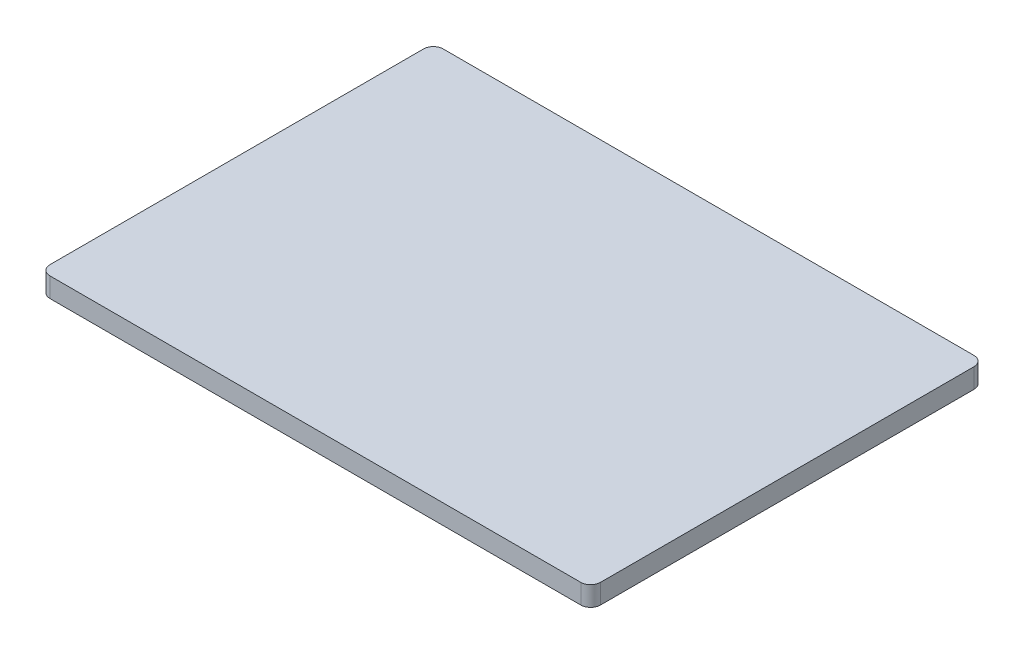
ISO-10303-21;
HEADER;
FILE_DESCRIPTION(('STEP AP214'),'2;1');
FILE_NAME('part.step','',(''),(''),'','','');
FILE_SCHEMA(('AUTOMOTIVE_DESIGN { 1 0 10303 214 1 1 1 1 }'));
ENDSEC;
DATA;
#1=APPLICATION_CONTEXT('core data for automotive mechanical design processes');
#2=APPLICATION_PROTOCOL_DEFINITION('international standard','automotive_design',2000,#1);
#3=PRODUCT_CONTEXT('',#1,'mechanical');
#4=PRODUCT('Part','Part','',(#3));
#5=PRODUCT_RELATED_PRODUCT_CATEGORY('part','',(#4));
#6=PRODUCT_DEFINITION_FORMATION('','',#4);
#7=PRODUCT_DEFINITION_CONTEXT('part definition',#1,'design');
#8=PRODUCT_DEFINITION('design','',#6,#7);
#9=PRODUCT_DEFINITION_SHAPE('','',#8);
#10=(LENGTH_UNIT() NAMED_UNIT(*) SI_UNIT(.MILLI.,.METRE.));
#11=(NAMED_UNIT(*) PLANE_ANGLE_UNIT() SI_UNIT($,.RADIAN.));
#12=(NAMED_UNIT(*) SI_UNIT($,.STERADIAN.) SOLID_ANGLE_UNIT());
#13=UNCERTAINTY_MEASURE_WITH_UNIT(LENGTH_MEASURE(1.E-05),#10,'distance_accuracy_value','');
#14=(GEOMETRIC_REPRESENTATION_CONTEXT(3) GLOBAL_UNCERTAINTY_ASSIGNED_CONTEXT((#13)) GLOBAL_UNIT_ASSIGNED_CONTEXT((#10,
#11,#12)) REPRESENTATION_CONTEXT('',''));
#15=CARTESIAN_POINT('',(0.,0.,0.));
#16=DIRECTION('',(0.,0.,1.));
#17=DIRECTION('',(1.,0.,0.));
#18=AXIS2_PLACEMENT_3D('',#15,#16,#17);
#19=CARTESIAN_POINT('',(140.,5.,100.));
#20=DIRECTION('',(-1.,0.,0.));
#21=DIRECTION('',(0.,0.,1.));
#22=AXIS2_PLACEMENT_3D('',#19,#20,#21);
#23=PLANE('',#22);
#24=DIRECTION('',(0.,0.,-1.));
#25=VECTOR('',#24,1.);
#26=CARTESIAN_POINT('',(140.,5.,100.));
#27=LINE('',#26,#25);
#28=CARTESIAN_POINT('',(140.,5.,95.));
#29=VERTEX_POINT('',#28);
#30=CARTESIAN_POINT('',(140.,5.,-95.));
#31=VERTEX_POINT('',#30);
#32=EDGE_CURVE('E122',#29,#31,#27,.T.);
#33=ORIENTED_EDGE('',*,*,#32,.F.);
#34=DIRECTION('',(0.,-1.,0.));
#35=VECTOR('',#34,1.);
#36=CARTESIAN_POINT('',(140.,5.,95.));
#37=LINE('',#36,#35);
#38=CARTESIAN_POINT('',(140.,-5.,95.));
#39=VERTEX_POINT('',#38);
#40=EDGE_CURVE('E107',#29,#39,#37,.T.);
#41=ORIENTED_EDGE('',*,*,#40,.T.);
#42=DIRECTION('',(0.,0.,-1.));
#43=VECTOR('',#42,1.);
#44=CARTESIAN_POINT('',(140.,-5.,100.));
#45=LINE('',#44,#43);
#46=CARTESIAN_POINT('',(140.,-5.,-95.));
#47=VERTEX_POINT('',#46);
#48=EDGE_CURVE('E119',#39,#47,#45,.T.);
#49=ORIENTED_EDGE('',*,*,#48,.T.);
#50=DIRECTION('',(0.,-1.,0.));
#51=VECTOR('',#50,1.);
#52=CARTESIAN_POINT('',(140.,5.,-95.));
#53=LINE('',#52,#51);
#54=EDGE_CURVE('E124',#47,#31,#53,.F.);
#55=ORIENTED_EDGE('',*,*,#54,.T.);
#56=EDGE_LOOP('',(#33,#41,#49,#55));
#57=FACE_BOUND('',#56,.T.);
#58=ADVANCED_FACE('F37',(#57),#23,.F.);
#59=CARTESIAN_POINT('',(-140.,5.,-100.));
#60=DIRECTION('',(0.,0.,1.));
#61=DIRECTION('',(1.,0.,0.));
#62=AXIS2_PLACEMENT_3D('',#59,#60,#61);
#63=PLANE('',#62);
#64=DIRECTION('',(-1.,0.,0.));
#65=VECTOR('',#64,1.);
#66=CARTESIAN_POINT('',(-140.,5.,-100.));
#67=LINE('',#66,#65);
#68=CARTESIAN_POINT('',(135.,5.,-100.));
#69=VERTEX_POINT('',#68);
#70=CARTESIAN_POINT('',(-135.,5.,-100.));
#71=VERTEX_POINT('',#70);
#72=EDGE_CURVE('E164',#69,#71,#67,.T.);
#73=ORIENTED_EDGE('',*,*,#72,.F.);
#74=DIRECTION('',(0.,-1.,0.));
#75=VECTOR('',#74,1.);
#76=CARTESIAN_POINT('',(135.,5.,-100.));
#77=LINE('',#76,#75);
#78=CARTESIAN_POINT('',(135.,-5.,-100.));
#79=VERTEX_POINT('',#78);
#80=EDGE_CURVE('E157',#69,#79,#77,.T.);
#81=ORIENTED_EDGE('',*,*,#80,.T.);
#82=DIRECTION('',(-1.,0.,0.));
#83=VECTOR('',#82,1.);
#84=CARTESIAN_POINT('',(-140.,-5.,-100.));
#85=LINE('',#84,#83);
#86=CARTESIAN_POINT('',(-135.,-5.,-100.));
#87=VERTEX_POINT('',#86);
#88=EDGE_CURVE('E128',#79,#87,#85,.T.);
#89=ORIENTED_EDGE('',*,*,#88,.T.);
#90=DIRECTION('',(0.,-1.,0.));
#91=VECTOR('',#90,1.);
#92=CARTESIAN_POINT('',(-135.,5.,-100.));
#93=LINE('',#92,#91);
#94=EDGE_CURVE('E155',#87,#71,#93,.F.);
#95=ORIENTED_EDGE('',*,*,#94,.T.);
#96=EDGE_LOOP('',(#73,#81,#89,#95));
#97=FACE_BOUND('',#96,.T.);
#98=ADVANCED_FACE('F162',(#97),#63,.F.);
#99=CARTESIAN_POINT('',(-140.,5.,100.));
#100=DIRECTION('',(1.,0.,0.));
#101=DIRECTION('',(0.,0.,-1.));
#102=AXIS2_PLACEMENT_3D('',#99,#100,#101);
#103=PLANE('',#102);
#104=DIRECTION('',(0.,0.,1.));
#105=VECTOR('',#104,1.);
#106=CARTESIAN_POINT('',(-140.,5.,100.));
#107=LINE('',#106,#105);
#108=CARTESIAN_POINT('',(-140.,5.,-95.));
#109=VERTEX_POINT('',#108);
#110=CARTESIAN_POINT('',(-140.,5.,95.));
#111=VERTEX_POINT('',#110);
#112=EDGE_CURVE('E172',#109,#111,#107,.T.);
#113=ORIENTED_EDGE('',*,*,#112,.F.);
#114=DIRECTION('',(0.,-1.,0.));
#115=VECTOR('',#114,1.);
#116=CARTESIAN_POINT('',(-140.,5.,-95.));
#117=LINE('',#116,#115);
#118=CARTESIAN_POINT('',(-140.,-5.,-95.));
#119=VERTEX_POINT('',#118);
#120=EDGE_CURVE('E11',#109,#119,#117,.T.);
#121=ORIENTED_EDGE('',*,*,#120,.T.);
#122=DIRECTION('',(0.,0.,1.));
#123=VECTOR('',#122,1.);
#124=CARTESIAN_POINT('',(-140.,-5.,100.));
#125=LINE('',#124,#123);
#126=CARTESIAN_POINT('',(-140.,-5.,95.));
#127=VERTEX_POINT('',#126);
#128=EDGE_CURVE('E131',#119,#127,#125,.T.);
#129=ORIENTED_EDGE('',*,*,#128,.T.);
#130=DIRECTION('',(0.,-1.,0.));
#131=VECTOR('',#130,1.);
#132=CARTESIAN_POINT('',(-140.,5.,95.));
#133=LINE('',#132,#131);
#134=EDGE_CURVE('E45',#127,#111,#133,.F.);
#135=ORIENTED_EDGE('',*,*,#134,.T.);
#136=EDGE_LOOP('',(#113,#121,#129,#135));
#137=FACE_BOUND('',#136,.T.);
#138=ADVANCED_FACE('F171',(#137),#103,.F.);
#139=CARTESIAN_POINT('',(-140.,5.,100.));
#140=DIRECTION('',(0.,0.,-1.));
#141=DIRECTION('',(-1.,0.,0.));
#142=AXIS2_PLACEMENT_3D('',#139,#140,#141);
#143=PLANE('',#142);
#144=DIRECTION('',(1.,0.,0.));
#145=VECTOR('',#144,1.);
#146=CARTESIAN_POINT('',(-140.,-5.,100.));
#147=LINE('',#146,#145);
#148=CARTESIAN_POINT('',(-135.,-5.,100.));
#149=VERTEX_POINT('',#148);
#150=CARTESIAN_POINT('',(135.,-5.,100.));
#151=VERTEX_POINT('',#150);
#152=EDGE_CURVE('E138',#149,#151,#147,.T.);
#153=ORIENTED_EDGE('',*,*,#152,.T.);
#154=DIRECTION('',(0.,-1.,0.));
#155=VECTOR('',#154,1.);
#156=CARTESIAN_POINT('',(135.,5.,100.));
#157=LINE('',#156,#155);
#158=CARTESIAN_POINT('',(135.,5.,100.));
#159=VERTEX_POINT('',#158);
#160=EDGE_CURVE('E108',#151,#159,#157,.F.);
#161=ORIENTED_EDGE('',*,*,#160,.T.);
#162=DIRECTION('',(1.,0.,0.));
#163=VECTOR('',#162,1.);
#164=CARTESIAN_POINT('',(-140.,5.,100.));
#165=LINE('',#164,#163);
#166=CARTESIAN_POINT('',(-135.,5.,100.));
#167=VERTEX_POINT('',#166);
#168=EDGE_CURVE('E134',#167,#159,#165,.T.);
#169=ORIENTED_EDGE('',*,*,#168,.F.);
#170=DIRECTION('',(0.,-1.,0.));
#171=VECTOR('',#170,1.);
#172=CARTESIAN_POINT('',(-135.,5.,100.));
#173=LINE('',#172,#171);
#174=EDGE_CURVE('E113',#167,#149,#173,.T.);
#175=ORIENTED_EDGE('',*,*,#174,.T.);
#176=EDGE_LOOP('',(#153,#161,#169,#175));
#177=FACE_BOUND('',#176,.T.);
#178=ADVANCED_FACE('F195',(#177),#143,.F.);
#179=CARTESIAN_POINT('',(0.,5.,0.));
#180=DIRECTION('',(0.,-1.,0.));
#181=DIRECTION('',(0.,0.,-1.));
#182=AXIS2_PLACEMENT_3D('',#179,#180,#181);
#183=PLANE('',#182);
#184=ORIENTED_EDGE('',*,*,#168,.T.);
#185=CARTESIAN_POINT('',(135.,5.,95.));
#186=DIRECTION('',(0.,-1.,0.));
#187=DIRECTION('',(0.,0.,-1.));
#188=AXIS2_PLACEMENT_3D('',#185,#186,#187);
#189=CIRCLE('',#188,5.);
#190=EDGE_CURVE('E153',#159,#29,#189,.F.);
#191=ORIENTED_EDGE('',*,*,#190,.T.);
#192=ORIENTED_EDGE('',*,*,#32,.T.);
#193=CARTESIAN_POINT('',(135.,5.,-95.));
#194=DIRECTION('',(0.,-1.,0.));
#195=DIRECTION('',(0.,0.,-1.));
#196=AXIS2_PLACEMENT_3D('',#193,#194,#195);
#197=CIRCLE('',#196,5.);
#198=EDGE_CURVE('E151',#31,#69,#197,.F.);
#199=ORIENTED_EDGE('',*,*,#198,.T.);
#200=ORIENTED_EDGE('',*,*,#72,.T.);
#201=CARTESIAN_POINT('',(-135.,5.,-95.));
#202=DIRECTION('',(0.,-1.,0.));
#203=DIRECTION('',(0.,0.,-1.));
#204=AXIS2_PLACEMENT_3D('',#201,#202,#203);
#205=CIRCLE('',#204,5.);
#206=EDGE_CURVE('E58',#71,#109,#205,.F.);
#207=ORIENTED_EDGE('',*,*,#206,.T.);
#208=ORIENTED_EDGE('',*,*,#112,.T.);
#209=CARTESIAN_POINT('',(-135.,5.,95.));
#210=DIRECTION('',(0.,-1.,0.));
#211=DIRECTION('',(0.,0.,-1.));
#212=AXIS2_PLACEMENT_3D('',#209,#210,#211);
#213=CIRCLE('',#212,5.);
#214=EDGE_CURVE('E148',#111,#167,#213,.F.);
#215=ORIENTED_EDGE('',*,*,#214,.T.);
#216=EDGE_LOOP('',(#184,#191,#192,#199,#200,#207,#208,#215));
#217=FACE_BOUND('',#216,.T.);
#218=ADVANCED_FACE('F177',(#217),#183,.F.);
#219=CARTESIAN_POINT('',(0.,-5.,0.));
#220=DIRECTION('',(0.,-1.,0.));
#221=DIRECTION('',(0.,0.,-1.));
#222=AXIS2_PLACEMENT_3D('',#219,#220,#221);
#223=PLANE('',#222);
#224=ORIENTED_EDGE('',*,*,#48,.F.);
#225=CARTESIAN_POINT('',(135.,-5.,95.));
#226=DIRECTION('',(0.,-1.,0.));
#227=DIRECTION('',(0.,0.,-1.));
#228=AXIS2_PLACEMENT_3D('',#225,#226,#227);
#229=CIRCLE('',#228,5.);
#230=EDGE_CURVE('E103',#39,#151,#229,.T.);
#231=ORIENTED_EDGE('',*,*,#230,.T.);
#232=ORIENTED_EDGE('',*,*,#152,.F.);
#233=CARTESIAN_POINT('',(-135.,-5.,95.));
#234=DIRECTION('',(0.,-1.,0.));
#235=DIRECTION('',(0.,0.,-1.));
#236=AXIS2_PLACEMENT_3D('',#233,#234,#235);
#237=CIRCLE('',#236,5.);
#238=EDGE_CURVE('E123',#149,#127,#237,.T.);
#239=ORIENTED_EDGE('',*,*,#238,.T.);
#240=ORIENTED_EDGE('',*,*,#128,.F.);
#241=CARTESIAN_POINT('',(-135.,-5.,-95.));
#242=DIRECTION('',(0.,-1.,0.));
#243=DIRECTION('',(0.,0.,-1.));
#244=AXIS2_PLACEMENT_3D('',#241,#242,#243);
#245=CIRCLE('',#244,5.);
#246=EDGE_CURVE('E142',#119,#87,#245,.T.);
#247=ORIENTED_EDGE('',*,*,#246,.T.);
#248=ORIENTED_EDGE('',*,*,#88,.F.);
#249=CARTESIAN_POINT('',(135.,-5.,-95.));
#250=DIRECTION('',(0.,-1.,0.));
#251=DIRECTION('',(0.,0.,-1.));
#252=AXIS2_PLACEMENT_3D('',#249,#250,#251);
#253=CIRCLE('',#252,5.);
#254=EDGE_CURVE('E114',#79,#47,#253,.T.);
#255=ORIENTED_EDGE('',*,*,#254,.T.);
#256=EDGE_LOOP('',(#224,#231,#232,#239,#240,#247,#248,#255));
#257=FACE_BOUND('',#256,.T.);
#258=ADVANCED_FACE('F126',(#257),#223,.T.);
#259=CARTESIAN_POINT('',(135.,5.,95.));
#260=DIRECTION('',(0.,-1.,0.));
#261=DIRECTION('',(0.,0.,-1.));
#262=AXIS2_PLACEMENT_3D('',#259,#260,#261);
#263=CYLINDRICAL_SURFACE('',#262,5.);
#264=ORIENTED_EDGE('',*,*,#190,.F.);
#265=ORIENTED_EDGE('',*,*,#160,.F.);
#266=ORIENTED_EDGE('',*,*,#230,.F.);
#267=ORIENTED_EDGE('',*,*,#40,.F.);
#268=EDGE_LOOP('',(#264,#265,#266,#267));
#269=FACE_BOUND('',#268,.T.);
#270=ADVANCED_FACE('F106',(#269),#263,.T.);
#271=CARTESIAN_POINT('',(135.,5.,-95.));
#272=DIRECTION('',(0.,-1.,0.));
#273=DIRECTION('',(0.,0.,-1.));
#274=AXIS2_PLACEMENT_3D('',#271,#272,#273);
#275=CYLINDRICAL_SURFACE('',#274,5.);
#276=ORIENTED_EDGE('',*,*,#198,.F.);
#277=ORIENTED_EDGE('',*,*,#54,.F.);
#278=ORIENTED_EDGE('',*,*,#254,.F.);
#279=ORIENTED_EDGE('',*,*,#80,.F.);
#280=EDGE_LOOP('',(#276,#277,#278,#279));
#281=FACE_BOUND('',#280,.T.);
#282=ADVANCED_FACE('F178',(#281),#275,.T.);
#283=CARTESIAN_POINT('',(-135.,5.,-95.));
#284=DIRECTION('',(0.,-1.,0.));
#285=DIRECTION('',(0.,0.,-1.));
#286=AXIS2_PLACEMENT_3D('',#283,#284,#285);
#287=CYLINDRICAL_SURFACE('',#286,5.);
#288=ORIENTED_EDGE('',*,*,#206,.F.);
#289=ORIENTED_EDGE('',*,*,#94,.F.);
#290=ORIENTED_EDGE('',*,*,#246,.F.);
#291=ORIENTED_EDGE('',*,*,#120,.F.);
#292=EDGE_LOOP('',(#288,#289,#290,#291));
#293=FACE_BOUND('',#292,.T.);
#294=ADVANCED_FACE('F170',(#293),#287,.T.);
#295=CARTESIAN_POINT('',(-135.,5.,95.));
#296=DIRECTION('',(0.,-1.,0.));
#297=DIRECTION('',(0.,0.,-1.));
#298=AXIS2_PLACEMENT_3D('',#295,#296,#297);
#299=CYLINDRICAL_SURFACE('',#298,5.);
#300=ORIENTED_EDGE('',*,*,#214,.F.);
#301=ORIENTED_EDGE('',*,*,#134,.F.);
#302=ORIENTED_EDGE('',*,*,#238,.F.);
#303=ORIENTED_EDGE('',*,*,#174,.F.);
#304=EDGE_LOOP('',(#300,#301,#302,#303));
#305=FACE_BOUND('',#304,.T.);
#306=ADVANCED_FACE('F39',(#305),#299,.T.);
#307=CLOSED_SHELL('',(#58,#98,#138,#178,#218,#258,#270,#282,#294,#306));
#308=MANIFOLD_SOLID_BREP('B2',#307);
#309=ADVANCED_BREP_SHAPE_REPRESENTATION('',(#18,#308),#14);
#310=SHAPE_DEFINITION_REPRESENTATION(#9,#309);
ENDSEC;
END-ISO-10303-21;
